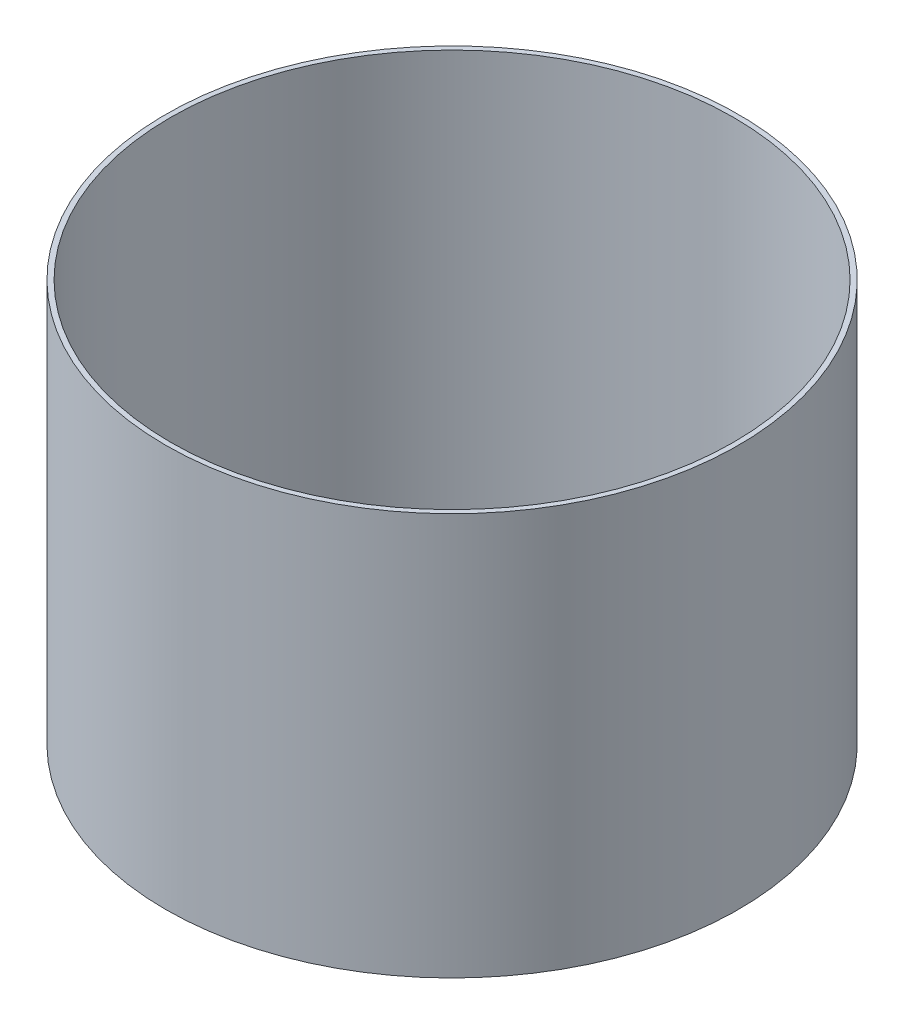
ISO-10303-21;
HEADER;
FILE_DESCRIPTION(('STEP AP214'),'2;1');
FILE_NAME('part.step','',(''),(''),'','','');
FILE_SCHEMA(('AUTOMOTIVE_DESIGN { 1 0 10303 214 1 1 1 1 }'));
ENDSEC;
DATA;
#1=APPLICATION_CONTEXT('core data for automotive mechanical design processes');
#2=APPLICATION_PROTOCOL_DEFINITION('international standard','automotive_design',2000,#1);
#3=PRODUCT_CONTEXT('',#1,'mechanical');
#4=PRODUCT('Part','Part','',(#3));
#5=PRODUCT_RELATED_PRODUCT_CATEGORY('part','',(#4));
#6=PRODUCT_DEFINITION_FORMATION('','',#4);
#7=PRODUCT_DEFINITION_CONTEXT('part definition',#1,'design');
#8=PRODUCT_DEFINITION('design','',#6,#7);
#9=PRODUCT_DEFINITION_SHAPE('','',#8);
#10=(LENGTH_UNIT() NAMED_UNIT(*) SI_UNIT(.MILLI.,.METRE.));
#11=(NAMED_UNIT(*) PLANE_ANGLE_UNIT() SI_UNIT($,.RADIAN.));
#12=(NAMED_UNIT(*) SI_UNIT($,.STERADIAN.) SOLID_ANGLE_UNIT());
#13=UNCERTAINTY_MEASURE_WITH_UNIT(LENGTH_MEASURE(1.E-05),#10,'distance_accuracy_value','');
#14=(GEOMETRIC_REPRESENTATION_CONTEXT(3) GLOBAL_UNCERTAINTY_ASSIGNED_CONTEXT((#13)) GLOBAL_UNIT_ASSIGNED_CONTEXT((#10,
#11,#12)) REPRESENTATION_CONTEXT('',''));
#15=CARTESIAN_POINT('',(0.,0.,0.));
#16=DIRECTION('',(0.,0.,1.));
#17=DIRECTION('',(1.,0.,0.));
#18=AXIS2_PLACEMENT_3D('',#15,#16,#17);
#19=CARTESIAN_POINT('',(0.,40.,0.));
#20=DIRECTION('',(0.,1.,0.));
#21=DIRECTION('',(0.,0.,1.));
#22=AXIS2_PLACEMENT_3D('',#19,#20,#21);
#23=PLANE('',#22);
#24=CARTESIAN_POINT('',(0.,40.,0.));
#25=DIRECTION('',(0.,1.,0.));
#26=DIRECTION('',(0.,0.,1.));
#27=AXIS2_PLACEMENT_3D('',#24,#25,#26);
#28=CIRCLE('',#27,28.5);
#29=CARTESIAN_POINT('',(0.,40.,28.5));
#30=VERTEX_POINT('',#29);
#31=EDGE_CURVE('E10',#30,#30,#28,.T.);
#32=ORIENTED_EDGE('',*,*,#31,.T.);
#33=EDGE_LOOP('',(#32));
#34=FACE_BOUND('',#33,.T.);
#35=CARTESIAN_POINT('',(0.,40.,0.));
#36=DIRECTION('',(0.,1.,0.));
#37=DIRECTION('',(0.,0.,1.));
#38=AXIS2_PLACEMENT_3D('',#35,#36,#37);
#39=CIRCLE('',#38,28.);
#40=CARTESIAN_POINT('',(0.,40.,28.));
#41=VERTEX_POINT('',#40);
#42=EDGE_CURVE('E42',#41,#41,#39,.T.);
#43=ORIENTED_EDGE('',*,*,#42,.F.);
#44=EDGE_LOOP('',(#43));
#45=FACE_BOUND('',#44,.T.);
#46=ADVANCED_FACE('F31',(#34,#45),#23,.T.);
#47=CARTESIAN_POINT('',(0.,0.,0.));
#48=DIRECTION('',(0.,1.,0.));
#49=DIRECTION('',(0.,0.,1.));
#50=AXIS2_PLACEMENT_3D('',#47,#48,#49);
#51=PLANE('',#50);
#52=CARTESIAN_POINT('',(0.,0.,0.));
#53=DIRECTION('',(0.,1.,0.));
#54=DIRECTION('',(0.,0.,1.));
#55=AXIS2_PLACEMENT_3D('',#52,#53,#54);
#56=CIRCLE('',#55,28.5);
#57=CARTESIAN_POINT('',(0.,0.,28.5));
#58=VERTEX_POINT('',#57);
#59=EDGE_CURVE('E35',#58,#58,#56,.T.);
#60=ORIENTED_EDGE('',*,*,#59,.F.);
#61=EDGE_LOOP('',(#60));
#62=FACE_BOUND('',#61,.T.);
#63=CARTESIAN_POINT('',(0.,0.,0.));
#64=DIRECTION('',(0.,1.,0.));
#65=DIRECTION('',(0.,0.,1.));
#66=AXIS2_PLACEMENT_3D('',#63,#64,#65);
#67=CIRCLE('',#66,28.);
#68=CARTESIAN_POINT('',(0.,0.,28.));
#69=VERTEX_POINT('',#68);
#70=EDGE_CURVE('E44',#69,#69,#67,.T.);
#71=ORIENTED_EDGE('',*,*,#70,.T.);
#72=EDGE_LOOP('',(#71));
#73=FACE_BOUND('',#72,.T.);
#74=ADVANCED_FACE('F54',(#62,#73),#51,.F.);
#75=CARTESIAN_POINT('',(0.,40.,0.));
#76=DIRECTION('',(0.,-1.,0.));
#77=DIRECTION('',(0.,0.,-1.));
#78=AXIS2_PLACEMENT_3D('',#75,#76,#77);
#79=CYLINDRICAL_SURFACE('',#78,28.5);
#80=ORIENTED_EDGE('',*,*,#31,.F.);
#81=EDGE_LOOP('',(#80));
#82=FACE_BOUND('',#81,.T.);
#83=ORIENTED_EDGE('',*,*,#59,.T.);
#84=EDGE_LOOP('',(#83));
#85=FACE_BOUND('',#84,.T.);
#86=ADVANCED_FACE('F33',(#82,#85),#79,.T.);
#87=CARTESIAN_POINT('',(0.,40.,0.));
#88=DIRECTION('',(0.,-1.,0.));
#89=DIRECTION('',(0.,0.,-1.));
#90=AXIS2_PLACEMENT_3D('',#87,#88,#89);
#91=CYLINDRICAL_SURFACE('',#90,28.);
#92=ORIENTED_EDGE('',*,*,#42,.T.);
#93=EDGE_LOOP('',(#92));
#94=FACE_BOUND('',#93,.T.);
#95=ORIENTED_EDGE('',*,*,#70,.F.);
#96=EDGE_LOOP('',(#95));
#97=FACE_BOUND('',#96,.T.);
#98=ADVANCED_FACE('F50',(#94,#97),#91,.F.);
#99=CLOSED_SHELL('',(#46,#74,#86,#98));
#100=MANIFOLD_SOLID_BREP('B2',#99);
#101=ADVANCED_BREP_SHAPE_REPRESENTATION('',(#18,#100),#14);
#102=SHAPE_DEFINITION_REPRESENTATION(#9,#101);
ENDSEC;
END-ISO-10303-21;
